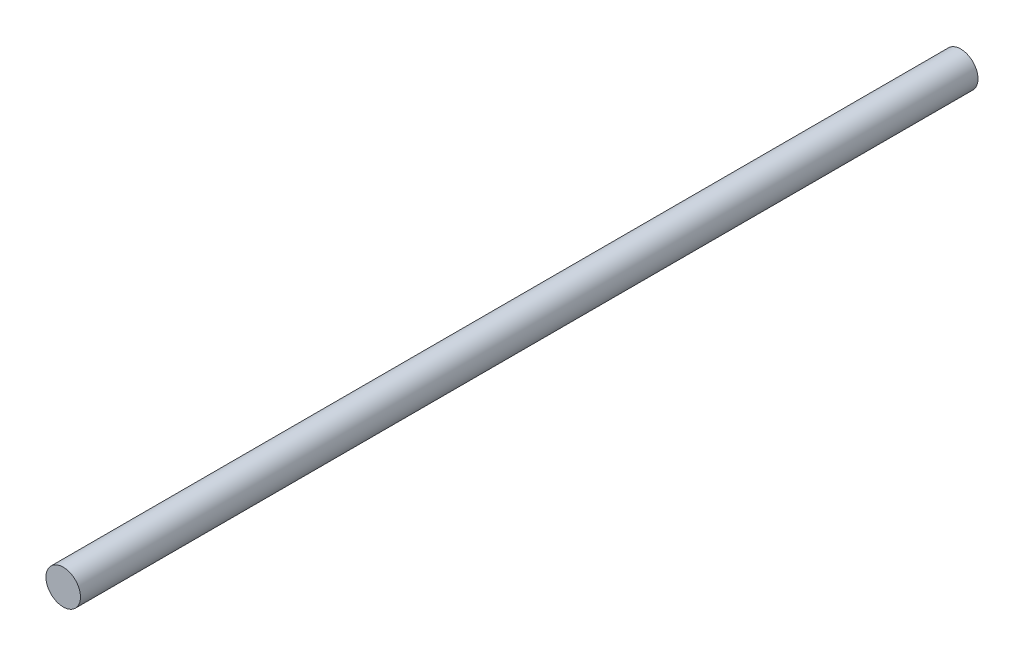
ISO-10303-21;
HEADER;
FILE_DESCRIPTION(('STEP AP214'),'2;1');
FILE_NAME('part.step','',(''),(''),'','','');
FILE_SCHEMA(('AUTOMOTIVE_DESIGN { 1 0 10303 214 1 1 1 1 }'));
ENDSEC;
DATA;
#1=APPLICATION_CONTEXT('core data for automotive mechanical design processes');
#2=APPLICATION_PROTOCOL_DEFINITION('international standard','automotive_design',2000,#1);
#3=PRODUCT_CONTEXT('',#1,'mechanical');
#4=PRODUCT('Part','Part','',(#3));
#5=PRODUCT_RELATED_PRODUCT_CATEGORY('part','',(#4));
#6=PRODUCT_DEFINITION_FORMATION('','',#4);
#7=PRODUCT_DEFINITION_CONTEXT('part definition',#1,'design');
#8=PRODUCT_DEFINITION('design','',#6,#7);
#9=PRODUCT_DEFINITION_SHAPE('','',#8);
#10=(LENGTH_UNIT() NAMED_UNIT(*) SI_UNIT(.MILLI.,.METRE.));
#11=(NAMED_UNIT(*) PLANE_ANGLE_UNIT() SI_UNIT($,.RADIAN.));
#12=(NAMED_UNIT(*) SI_UNIT($,.STERADIAN.) SOLID_ANGLE_UNIT());
#13=UNCERTAINTY_MEASURE_WITH_UNIT(LENGTH_MEASURE(1.E-05),#10,'distance_accuracy_value','');
#14=(GEOMETRIC_REPRESENTATION_CONTEXT(3) GLOBAL_UNCERTAINTY_ASSIGNED_CONTEXT((#13)) GLOBAL_UNIT_ASSIGNED_CONTEXT((#10,
#11,#12)) REPRESENTATION_CONTEXT('',''));
#15=CARTESIAN_POINT('',(0.,0.,0.));
#16=DIRECTION('',(0.,0.,1.));
#17=DIRECTION('',(1.,0.,0.));
#18=AXIS2_PLACEMENT_3D('',#15,#16,#17);
#19=CARTESIAN_POINT('',(0.,0.,0.));
#20=DIRECTION('',(0.,0.,1.));
#21=DIRECTION('',(1.,0.,0.));
#22=AXIS2_PLACEMENT_3D('',#19,#20,#21);
#23=PLANE('',#22);
#24=CARTESIAN_POINT('',(0.,0.,0.));
#25=DIRECTION('',(0.,0.,1.));
#26=DIRECTION('',(1.,0.,0.));
#27=AXIS2_PLACEMENT_3D('',#24,#25,#26);
#28=CIRCLE('',#27,2.5);
#29=CARTESIAN_POINT('',(2.5,0.,0.));
#30=VERTEX_POINT('',#29);
#31=EDGE_CURVE('E42',#30,#30,#28,.T.);
#32=ORIENTED_EDGE('',*,*,#31,.F.);
#33=EDGE_LOOP('',(#32));
#34=FACE_BOUND('',#33,.T.);
#35=ADVANCED_FACE('F35',(#34),#23,.F.);
#36=CARTESIAN_POINT('',(0.,0.,130.));
#37=DIRECTION('',(0.,0.,1.));
#38=DIRECTION('',(1.,0.,0.));
#39=AXIS2_PLACEMENT_3D('',#36,#37,#38);
#40=PLANE('',#39);
#41=CARTESIAN_POINT('',(0.,0.,130.));
#42=DIRECTION('',(0.,0.,1.));
#43=DIRECTION('',(1.,0.,0.));
#44=AXIS2_PLACEMENT_3D('',#41,#42,#43);
#45=CIRCLE('',#44,2.5);
#46=CARTESIAN_POINT('',(2.5,0.,130.));
#47=VERTEX_POINT('',#46);
#48=EDGE_CURVE('E11',#47,#47,#45,.T.);
#49=ORIENTED_EDGE('',*,*,#48,.T.);
#50=EDGE_LOOP('',(#49));
#51=FACE_BOUND('',#50,.T.);
#52=ADVANCED_FACE('F49',(#51),#40,.T.);
#53=CARTESIAN_POINT('',(0.,0.,0.));
#54=DIRECTION('',(0.,0.,1.));
#55=DIRECTION('',(1.,0.,0.));
#56=AXIS2_PLACEMENT_3D('',#53,#54,#55);
#57=CYLINDRICAL_SURFACE('',#56,2.5);
#58=ORIENTED_EDGE('',*,*,#48,.F.);
#59=EDGE_LOOP('',(#58));
#60=FACE_BOUND('',#59,.T.);
#61=ORIENTED_EDGE('',*,*,#31,.T.);
#62=EDGE_LOOP('',(#61));
#63=FACE_BOUND('',#62,.T.);
#64=ADVANCED_FACE('F51',(#60,#63),#57,.T.);
#65=CLOSED_SHELL('',(#35,#52,#64));
#66=MANIFOLD_SOLID_BREP('B2',#65);
#67=ADVANCED_BREP_SHAPE_REPRESENTATION('',(#18,#66),#14);
#68=SHAPE_DEFINITION_REPRESENTATION(#9,#67);
ENDSEC;
END-ISO-10303-21;
